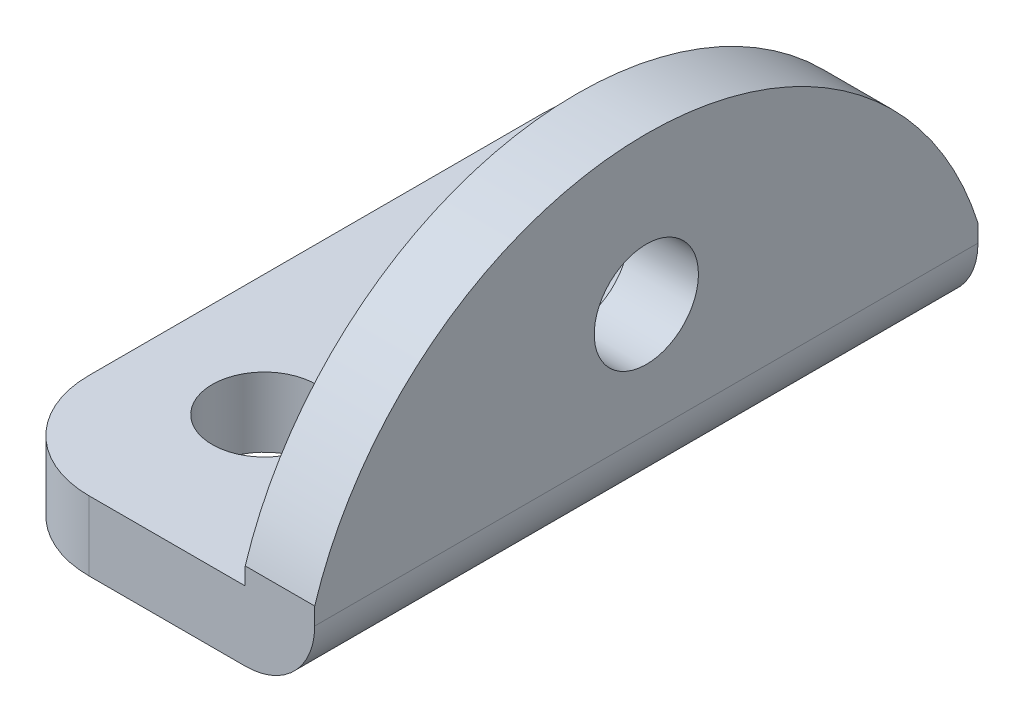
ISO-10303-21;
HEADER;
FILE_DESCRIPTION(('STEP AP214'),'2;1');
FILE_NAME('part.step','',(''),(''),'','','');
FILE_SCHEMA(('AUTOMOTIVE_DESIGN { 1 0 10303 214 1 1 1 1 }'));
ENDSEC;
DATA;
#1=APPLICATION_CONTEXT('core data for automotive mechanical design processes');
#2=APPLICATION_PROTOCOL_DEFINITION('international standard','automotive_design',2000,#1);
#3=PRODUCT_CONTEXT('',#1,'mechanical');
#4=PRODUCT('Part','Part','',(#3));
#5=PRODUCT_RELATED_PRODUCT_CATEGORY('part','',(#4));
#6=PRODUCT_DEFINITION_FORMATION('','',#4);
#7=PRODUCT_DEFINITION_CONTEXT('part definition',#1,'design');
#8=PRODUCT_DEFINITION('design','',#6,#7);
#9=PRODUCT_DEFINITION_SHAPE('','',#8);
#10=(LENGTH_UNIT() NAMED_UNIT(*) SI_UNIT(.MILLI.,.METRE.));
#11=(NAMED_UNIT(*) PLANE_ANGLE_UNIT() SI_UNIT($,.RADIAN.));
#12=(NAMED_UNIT(*) SI_UNIT($,.STERADIAN.) SOLID_ANGLE_UNIT());
#13=UNCERTAINTY_MEASURE_WITH_UNIT(LENGTH_MEASURE(1.E-05),#10,'distance_accuracy_value','');
#14=(GEOMETRIC_REPRESENTATION_CONTEXT(3) GLOBAL_UNCERTAINTY_ASSIGNED_CONTEXT((#13)) GLOBAL_UNIT_ASSIGNED_CONTEXT((#10,
#11,#12)) REPRESENTATION_CONTEXT('',''));
#15=CARTESIAN_POINT('',(0.,0.,0.));
#16=DIRECTION('',(0.,0.,1.));
#17=DIRECTION('',(1.,0.,0.));
#18=AXIS2_PLACEMENT_3D('',#15,#16,#17);
#19=CARTESIAN_POINT('',(0.,5.25,0.));
#20=DIRECTION('',(1.,0.,0.));
#21=DIRECTION('',(0.,0.,-1.));
#22=AXIS2_PLACEMENT_3D('',#19,#20,#21);
#23=CYLINDRICAL_SURFACE('',#22,1.5);
#24=CARTESIAN_POINT('',(0.,5.25,0.));
#25=DIRECTION('',(1.,0.,0.));
#26=DIRECTION('',(0.,0.,-1.));
#27=AXIS2_PLACEMENT_3D('',#24,#25,#26);
#28=CIRCLE('',#27,1.5);
#29=CARTESIAN_POINT('',(0.,5.25,-1.5));
#30=VERTEX_POINT('',#29);
#31=EDGE_CURVE('E110',#30,#30,#28,.F.);
#32=ORIENTED_EDGE('',*,*,#31,.F.);
#33=EDGE_LOOP('',(#32));
#34=FACE_BOUND('',#33,.T.);
#35=CARTESIAN_POINT('',(-2.,5.25,0.));
#36=DIRECTION('',(1.,0.,0.));
#37=DIRECTION('',(0.,0.,-1.));
#38=AXIS2_PLACEMENT_3D('',#35,#36,#37);
#39=CIRCLE('',#38,1.5);
#40=CARTESIAN_POINT('',(-2.,5.25,-1.5));
#41=VERTEX_POINT('',#40);
#42=EDGE_CURVE('E19',#41,#41,#39,.F.);
#43=ORIENTED_EDGE('',*,*,#42,.T.);
#44=EDGE_LOOP('',(#43));
#45=FACE_BOUND('',#44,.T.);
#46=ADVANCED_FACE('F16',(#34,#45),#23,.F.);
#47=CARTESIAN_POINT('',(0.,-0.514464285714287,0.));
#48=DIRECTION('',(1.,0.,0.));
#49=DIRECTION('',(0.,0.,-1.));
#50=AXIS2_PLACEMENT_3D('',#47,#48,#49);
#51=CYLINDRICAL_SURFACE('',#50,10.0144642857143);
#52=CARTESIAN_POINT('',(-2.,-0.514464285714287,0.));
#53=DIRECTION('',(1.,0.,0.));
#54=DIRECTION('',(0.,0.,-1.));
#55=AXIS2_PLACEMENT_3D('',#52,#53,#54);
#56=CIRCLE('',#55,10.0144642857143);
#57=CARTESIAN_POINT('',(-2.,2.5,-9.55));
#58=VERTEX_POINT('',#57);
#59=CARTESIAN_POINT('',(-2.,2.5,9.55));
#60=VERTEX_POINT('',#59);
#61=EDGE_CURVE('E88',#58,#60,#56,.T.);
#62=ORIENTED_EDGE('',*,*,#61,.T.);
#63=DIRECTION('',(1.,0.,0.));
#64=VECTOR('',#63,1.);
#65=CARTESIAN_POINT('',(-2.,2.5,9.55));
#66=LINE('',#65,#64);
#67=CARTESIAN_POINT('',(0.,2.5,9.55));
#68=VERTEX_POINT('',#67);
#69=EDGE_CURVE('E92',#68,#60,#66,.F.);
#70=ORIENTED_EDGE('',*,*,#69,.F.);
#71=CARTESIAN_POINT('',(0.,-0.514464285714287,0.));
#72=DIRECTION('',(1.,0.,0.));
#73=DIRECTION('',(0.,0.,-1.));
#74=AXIS2_PLACEMENT_3D('',#71,#72,#73);
#75=CIRCLE('',#74,10.0144642857143);
#76=CARTESIAN_POINT('',(0.,2.5,-9.55));
#77=VERTEX_POINT('',#76);
#78=EDGE_CURVE('E113',#77,#68,#75,.T.);
#79=ORIENTED_EDGE('',*,*,#78,.F.);
#80=DIRECTION('',(1.,0.,0.));
#81=VECTOR('',#80,1.);
#82=CARTESIAN_POINT('',(0.,2.5,-9.55));
#83=LINE('',#82,#81);
#84=EDGE_CURVE('E94',#77,#58,#83,.F.);
#85=ORIENTED_EDGE('',*,*,#84,.T.);
#86=EDGE_LOOP('',(#62,#70,#79,#85));
#87=FACE_BOUND('',#86,.T.);
#88=ADVANCED_FACE('F90',(#87),#51,.T.);
#89=CARTESIAN_POINT('',(-2.,0.,9.55));
#90=DIRECTION('',(1.,0.,0.));
#91=DIRECTION('',(0.,0.,-1.));
#92=AXIS2_PLACEMENT_3D('',#89,#90,#91);
#93=PLANE('',#92);
#94=ORIENTED_EDGE('',*,*,#61,.F.);
#95=DIRECTION('',(0.,1.,0.));
#96=VECTOR('',#95,1.);
#97=CARTESIAN_POINT('',(-2.,0.,-9.55));
#98=LINE('',#97,#96);
#99=CARTESIAN_POINT('',(-2.,2.,-9.55));
#100=VERTEX_POINT('',#99);
#101=EDGE_CURVE('E83',#100,#58,#98,.T.);
#102=ORIENTED_EDGE('',*,*,#101,.F.);
#103=DIRECTION('',(0.,0.,1.));
#104=VECTOR('',#103,1.);
#105=CARTESIAN_POINT('',(-2.,2.,9.55));
#106=LINE('',#105,#104);
#107=CARTESIAN_POINT('',(-2.,2.,9.55));
#108=VERTEX_POINT('',#107);
#109=EDGE_CURVE('E108',#100,#108,#106,.T.);
#110=ORIENTED_EDGE('',*,*,#109,.T.);
#111=DIRECTION('',(0.,1.,0.));
#112=VECTOR('',#111,1.);
#113=CARTESIAN_POINT('',(-2.,0.,9.55));
#114=LINE('',#113,#112);
#115=EDGE_CURVE('E97',#60,#108,#114,.F.);
#116=ORIENTED_EDGE('',*,*,#115,.F.);
#117=EDGE_LOOP('',(#94,#102,#110,#116));
#118=FACE_BOUND('',#117,.T.);
#119=ORIENTED_EDGE('',*,*,#42,.F.);
#120=EDGE_LOOP('',(#119));
#121=FACE_BOUND('',#120,.T.);
#122=ADVANCED_FACE('F105',(#118,#121),#93,.F.);
#123=CARTESIAN_POINT('',(0.,0.,9.55));
#124=DIRECTION('',(1.,0.,0.));
#125=DIRECTION('',(0.,0.,-1.));
#126=AXIS2_PLACEMENT_3D('',#123,#124,#125);
#127=PLANE('',#126);
#128=DIRECTION('',(0.,0.,-1.));
#129=VECTOR('',#128,1.);
#130=CARTESIAN_POINT('',(0.,2.,9.55));
#131=LINE('',#130,#129);
#132=CARTESIAN_POINT('',(0.,2.,-9.55));
#133=VERTEX_POINT('',#132);
#134=CARTESIAN_POINT('',(0.,2.,9.55));
#135=VERTEX_POINT('',#134);
#136=EDGE_CURVE('E145',#133,#135,#131,.F.);
#137=ORIENTED_EDGE('',*,*,#136,.F.);
#138=DIRECTION('',(0.,1.,0.));
#139=VECTOR('',#138,1.);
#140=CARTESIAN_POINT('',(0.,2.,-9.55));
#141=LINE('',#140,#139);
#142=EDGE_CURVE('E125',#77,#133,#141,.F.);
#143=ORIENTED_EDGE('',*,*,#142,.F.);
#144=ORIENTED_EDGE('',*,*,#78,.T.);
#145=DIRECTION('',(0.,1.,0.));
#146=VECTOR('',#145,1.);
#147=CARTESIAN_POINT('',(0.,0.,9.55));
#148=LINE('',#147,#146);
#149=EDGE_CURVE('E102',#68,#135,#148,.F.);
#150=ORIENTED_EDGE('',*,*,#149,.T.);
#151=EDGE_LOOP('',(#137,#143,#144,#150));
#152=FACE_BOUND('',#151,.T.);
#153=ORIENTED_EDGE('',*,*,#31,.T.);
#154=EDGE_LOOP('',(#153));
#155=FACE_BOUND('',#154,.T.);
#156=ADVANCED_FACE('F203',(#152,#155),#127,.T.);
#157=CARTESIAN_POINT('',(0.,2.,9.55));
#158=DIRECTION('',(0.,-1.,0.));
#159=DIRECTION('',(1.,0.,0.));
#160=AXIS2_PLACEMENT_3D('',#157,#158,#159);
#161=PLANE('',#160);
#162=CARTESIAN_POINT('',(-6.5,2.,-6.55));
#163=DIRECTION('',(0.,-1.,0.));
#164=DIRECTION('',(0.,0.,-1.));
#165=AXIS2_PLACEMENT_3D('',#162,#163,#164);
#166=CIRCLE('',#165,3.);
#167=CARTESIAN_POINT('',(-9.5,2.,-6.55));
#168=VERTEX_POINT('',#167);
#169=CARTESIAN_POINT('',(-6.5,2.,-9.55));
#170=VERTEX_POINT('',#169);
#171=EDGE_CURVE('E150',#168,#170,#166,.T.);
#172=ORIENTED_EDGE('',*,*,#171,.F.);
#173=DIRECTION('',(0.,0.,1.));
#174=VECTOR('',#173,1.);
#175=CARTESIAN_POINT('',(-9.5,2.,9.55));
#176=LINE('',#175,#174);
#177=CARTESIAN_POINT('',(-9.5,2.,6.55));
#178=VERTEX_POINT('',#177);
#179=EDGE_CURVE('E158',#178,#168,#176,.F.);
#180=ORIENTED_EDGE('',*,*,#179,.F.);
#181=CARTESIAN_POINT('',(-6.5,2.,6.55));
#182=DIRECTION('',(0.,1.,0.));
#183=DIRECTION('',(0.,0.,1.));
#184=AXIS2_PLACEMENT_3D('',#181,#182,#183);
#185=CIRCLE('',#184,3.);
#186=CARTESIAN_POINT('',(-6.5,2.,9.55));
#187=VERTEX_POINT('',#186);
#188=EDGE_CURVE('E139',#187,#178,#185,.F.);
#189=ORIENTED_EDGE('',*,*,#188,.F.);
#190=DIRECTION('',(1.,0.,0.));
#191=VECTOR('',#190,1.);
#192=CARTESIAN_POINT('',(-2.,2.,9.55));
#193=LINE('',#192,#191);
#194=EDGE_CURVE('E144',#108,#187,#193,.F.);
#195=ORIENTED_EDGE('',*,*,#194,.F.);
#196=ORIENTED_EDGE('',*,*,#109,.F.);
#197=DIRECTION('',(1.,0.,0.));
#198=VECTOR('',#197,1.);
#199=CARTESIAN_POINT('',(-2.,2.,-9.55));
#200=LINE('',#199,#198);
#201=EDGE_CURVE('E153',#100,#170,#200,.F.);
#202=ORIENTED_EDGE('',*,*,#201,.T.);
#203=EDGE_LOOP('',(#172,#180,#189,#195,#196,#202));
#204=FACE_BOUND('',#203,.T.);
#205=CARTESIAN_POINT('',(-6.,2.,-5.));
#206=DIRECTION('',(0.,1.,0.));
#207=DIRECTION('',(-1.,0.,0.));
#208=AXIS2_PLACEMENT_3D('',#205,#206,#207);
#209=CIRCLE('',#208,1.5);
#210=CARTESIAN_POINT('',(-7.5,2.,-5.));
#211=VERTEX_POINT('',#210);
#212=EDGE_CURVE('E155',#211,#211,#209,.F.);
#213=ORIENTED_EDGE('',*,*,#212,.T.);
#214=EDGE_LOOP('',(#213));
#215=FACE_BOUND('',#214,.T.);
#216=CARTESIAN_POINT('',(-6.,2.,5.));
#217=DIRECTION('',(0.,1.,0.));
#218=DIRECTION('',(-1.,0.,0.));
#219=AXIS2_PLACEMENT_3D('',#216,#217,#218);
#220=CIRCLE('',#219,1.5);
#221=CARTESIAN_POINT('',(-7.5,2.,5.));
#222=VERTEX_POINT('',#221);
#223=EDGE_CURVE('E159',#222,#222,#220,.F.);
#224=ORIENTED_EDGE('',*,*,#223,.T.);
#225=EDGE_LOOP('',(#224));
#226=FACE_BOUND('',#225,.T.);
#227=ADVANCED_FACE('F288',(#204,#215,#226),#161,.F.);
#228=CARTESIAN_POINT('',(-6.,-1.,5.));
#229=DIRECTION('',(0.,1.,0.));
#230=DIRECTION('',(-1.,0.,0.));
#231=AXIS2_PLACEMENT_3D('',#228,#229,#230);
#232=CYLINDRICAL_SURFACE('',#231,1.5);
#233=CARTESIAN_POINT('',(-6.,0.,5.));
#234=DIRECTION('',(0.,1.,0.));
#235=DIRECTION('',(-1.,0.,0.));
#236=AXIS2_PLACEMENT_3D('',#233,#234,#235);
#237=CIRCLE('',#236,1.5);
#238=CARTESIAN_POINT('',(-7.5,0.,5.));
#239=VERTEX_POINT('',#238);
#240=EDGE_CURVE('E135',#239,#239,#237,.T.);
#241=ORIENTED_EDGE('',*,*,#240,.F.);
#242=EDGE_LOOP('',(#241));
#243=FACE_BOUND('',#242,.T.);
#244=ORIENTED_EDGE('',*,*,#223,.F.);
#245=EDGE_LOOP('',(#244));
#246=FACE_BOUND('',#245,.T.);
#247=ADVANCED_FACE('F279',(#243,#246),#232,.F.);
#248=CARTESIAN_POINT('',(-6.,-1.,-5.));
#249=DIRECTION('',(0.,1.,0.));
#250=DIRECTION('',(-1.,0.,0.));
#251=AXIS2_PLACEMENT_3D('',#248,#249,#250);
#252=CYLINDRICAL_SURFACE('',#251,1.5);
#253=CARTESIAN_POINT('',(-6.,0.,-5.));
#254=DIRECTION('',(0.,1.,0.));
#255=DIRECTION('',(-1.,0.,0.));
#256=AXIS2_PLACEMENT_3D('',#253,#254,#255);
#257=CIRCLE('',#256,1.5);
#258=CARTESIAN_POINT('',(-7.5,0.,-5.));
#259=VERTEX_POINT('',#258);
#260=EDGE_CURVE('E132',#259,#259,#257,.T.);
#261=ORIENTED_EDGE('',*,*,#260,.F.);
#262=EDGE_LOOP('',(#261));
#263=FACE_BOUND('',#262,.T.);
#264=ORIENTED_EDGE('',*,*,#212,.F.);
#265=EDGE_LOOP('',(#264));
#266=FACE_BOUND('',#265,.T.);
#267=ADVANCED_FACE('F270',(#263,#266),#252,.F.);
#268=CARTESIAN_POINT('',(-9.5,0.,9.55));
#269=DIRECTION('',(-1.,0.,0.));
#270=DIRECTION('',(0.,0.,1.));
#271=AXIS2_PLACEMENT_3D('',#268,#269,#270);
#272=PLANE('',#271);
#273=DIRECTION('',(0.,0.,1.));
#274=VECTOR('',#273,1.);
#275=CARTESIAN_POINT('',(-9.5,0.,9.55));
#276=LINE('',#275,#274);
#277=CARTESIAN_POINT('',(-9.5,0.,6.55));
#278=VERTEX_POINT('',#277);
#279=CARTESIAN_POINT('',(-9.5,0.,-6.55));
#280=VERTEX_POINT('',#279);
#281=EDGE_CURVE('E131',#278,#280,#276,.F.);
#282=ORIENTED_EDGE('',*,*,#281,.F.);
#283=DIRECTION('',(0.,1.,0.));
#284=VECTOR('',#283,1.);
#285=CARTESIAN_POINT('',(-9.5,0.,6.55));
#286=LINE('',#285,#284);
#287=EDGE_CURVE('E138',#178,#278,#286,.F.);
#288=ORIENTED_EDGE('',*,*,#287,.F.);
#289=ORIENTED_EDGE('',*,*,#179,.T.);
#290=DIRECTION('',(0.,-1.,0.));
#291=VECTOR('',#290,1.);
#292=CARTESIAN_POINT('',(-9.5,2.,-6.55));
#293=LINE('',#292,#291);
#294=EDGE_CURVE('E154',#280,#168,#293,.F.);
#295=ORIENTED_EDGE('',*,*,#294,.F.);
#296=EDGE_LOOP('',(#282,#288,#289,#295));
#297=FACE_BOUND('',#296,.T.);
#298=ADVANCED_FACE('F215',(#297),#272,.T.);
#299=CARTESIAN_POINT('',(-6.5,2.,-6.55));
#300=DIRECTION('',(0.,-1.,0.));
#301=DIRECTION('',(0.,0.,-1.));
#302=AXIS2_PLACEMENT_3D('',#299,#300,#301);
#303=CYLINDRICAL_SURFACE('',#302,3.);
#304=ORIENTED_EDGE('',*,*,#171,.T.);
#305=DIRECTION('',(0.,1.,0.));
#306=VECTOR('',#305,1.);
#307=CARTESIAN_POINT('',(-6.5,2.,-9.55));
#308=LINE('',#307,#306);
#309=CARTESIAN_POINT('',(-6.5,0.,-9.55));
#310=VERTEX_POINT('',#309);
#311=EDGE_CURVE('E149',#170,#310,#308,.F.);
#312=ORIENTED_EDGE('',*,*,#311,.T.);
#313=CARTESIAN_POINT('',(-6.5,0.,-6.55));
#314=DIRECTION('',(0.,-1.,0.));
#315=DIRECTION('',(0.,0.,-1.));
#316=AXIS2_PLACEMENT_3D('',#313,#314,#315);
#317=CIRCLE('',#316,3.);
#318=EDGE_CURVE('E127',#280,#310,#317,.T.);
#319=ORIENTED_EDGE('',*,*,#318,.F.);
#320=ORIENTED_EDGE('',*,*,#294,.T.);
#321=EDGE_LOOP('',(#304,#312,#319,#320));
#322=FACE_BOUND('',#321,.T.);
#323=ADVANCED_FACE('F207',(#322),#303,.T.);
#324=CARTESIAN_POINT('',(-2.,2.,-9.55));
#325=DIRECTION('',(0.,0.,1.));
#326=DIRECTION('',(1.,0.,0.));
#327=AXIS2_PLACEMENT_3D('',#324,#325,#326);
#328=PLANE('',#327);
#329=ORIENTED_EDGE('',*,*,#311,.F.);
#330=ORIENTED_EDGE('',*,*,#201,.F.);
#331=ORIENTED_EDGE('',*,*,#101,.T.);
#332=ORIENTED_EDGE('',*,*,#84,.F.);
#333=ORIENTED_EDGE('',*,*,#142,.T.);
#334=CARTESIAN_POINT('',(-2.,2.,-9.55));
#335=DIRECTION('',(0.,0.,-1.));
#336=DIRECTION('',(-1.,0.,0.));
#337=AXIS2_PLACEMENT_3D('',#334,#335,#336);
#338=CIRCLE('',#337,2.);
#339=CARTESIAN_POINT('',(-2.,0.,-9.55));
#340=VERTEX_POINT('',#339);
#341=EDGE_CURVE('E146',#340,#133,#338,.F.);
#342=ORIENTED_EDGE('',*,*,#341,.F.);
#343=DIRECTION('',(1.,0.,0.));
#344=VECTOR('',#343,1.);
#345=CARTESIAN_POINT('',(0.,0.,-9.55));
#346=LINE('',#345,#344);
#347=EDGE_CURVE('E130',#310,#340,#346,.T.);
#348=ORIENTED_EDGE('',*,*,#347,.F.);
#349=EDGE_LOOP('',(#329,#330,#331,#332,#333,#342,#348));
#350=FACE_BOUND('',#349,.T.);
#351=ADVANCED_FACE('F205',(#350),#328,.F.);
#352=CARTESIAN_POINT('',(-2.,2.,9.55));
#353=DIRECTION('',(0.,0.,-1.));
#354=DIRECTION('',(-1.,0.,0.));
#355=AXIS2_PLACEMENT_3D('',#352,#353,#354);
#356=CYLINDRICAL_SURFACE('',#355,2.);
#357=CARTESIAN_POINT('',(-2.,2.,9.55));
#358=DIRECTION('',(0.,0.,-1.));
#359=DIRECTION('',(-1.,0.,0.));
#360=AXIS2_PLACEMENT_3D('',#357,#358,#359);
#361=CIRCLE('',#360,2.);
#362=CARTESIAN_POINT('',(-2.,0.,9.55));
#363=VERTEX_POINT('',#362);
#364=EDGE_CURVE('E142',#135,#363,#361,.T.);
#365=ORIENTED_EDGE('',*,*,#364,.T.);
#366=DIRECTION('',(0.,0.,1.));
#367=VECTOR('',#366,1.);
#368=CARTESIAN_POINT('',(-2.,0.,9.55));
#369=LINE('',#368,#367);
#370=EDGE_CURVE('E177',#340,#363,#369,.T.);
#371=ORIENTED_EDGE('',*,*,#370,.F.);
#372=ORIENTED_EDGE('',*,*,#341,.T.);
#373=ORIENTED_EDGE('',*,*,#136,.T.);
#374=EDGE_LOOP('',(#365,#371,#372,#373));
#375=FACE_BOUND('',#374,.T.);
#376=ADVANCED_FACE('F201',(#375),#356,.T.);
#377=CARTESIAN_POINT('',(-2.,2.,9.55));
#378=DIRECTION('',(0.,0.,1.));
#379=DIRECTION('',(1.,0.,0.));
#380=AXIS2_PLACEMENT_3D('',#377,#378,#379);
#381=PLANE('',#380);
#382=DIRECTION('',(1.,0.,0.));
#383=VECTOR('',#382,1.);
#384=CARTESIAN_POINT('',(0.,0.,9.55));
#385=LINE('',#384,#383);
#386=CARTESIAN_POINT('',(-6.5,0.,9.55));
#387=VERTEX_POINT('',#386);
#388=EDGE_CURVE('E25',#363,#387,#385,.F.);
#389=ORIENTED_EDGE('',*,*,#388,.F.);
#390=ORIENTED_EDGE('',*,*,#364,.F.);
#391=ORIENTED_EDGE('',*,*,#149,.F.);
#392=ORIENTED_EDGE('',*,*,#69,.T.);
#393=ORIENTED_EDGE('',*,*,#115,.T.);
#394=ORIENTED_EDGE('',*,*,#194,.T.);
#395=DIRECTION('',(0.,1.,0.));
#396=VECTOR('',#395,1.);
#397=CARTESIAN_POINT('',(-6.5,0.,9.55));
#398=LINE('',#397,#396);
#399=EDGE_CURVE('E34',#387,#187,#398,.T.);
#400=ORIENTED_EDGE('',*,*,#399,.F.);
#401=EDGE_LOOP('',(#389,#390,#391,#392,#393,#394,#400));
#402=FACE_BOUND('',#401,.T.);
#403=ADVANCED_FACE('F99',(#402),#381,.T.);
#404=CARTESIAN_POINT('',(-6.5,0.,6.55));
#405=DIRECTION('',(0.,1.,0.));
#406=DIRECTION('',(0.,0.,1.));
#407=AXIS2_PLACEMENT_3D('',#404,#405,#406);
#408=CYLINDRICAL_SURFACE('',#407,3.);
#409=ORIENTED_EDGE('',*,*,#188,.T.);
#410=ORIENTED_EDGE('',*,*,#287,.T.);
#411=CARTESIAN_POINT('',(-6.5,0.,6.55));
#412=DIRECTION('',(0.,1.,0.));
#413=DIRECTION('',(0.,0.,1.));
#414=AXIS2_PLACEMENT_3D('',#411,#412,#413);
#415=CIRCLE('',#414,3.);
#416=EDGE_CURVE('E11',#387,#278,#415,.F.);
#417=ORIENTED_EDGE('',*,*,#416,.F.);
#418=ORIENTED_EDGE('',*,*,#399,.T.);
#419=EDGE_LOOP('',(#409,#410,#417,#418));
#420=FACE_BOUND('',#419,.T.);
#421=ADVANCED_FACE('F218',(#420),#408,.T.);
#422=CARTESIAN_POINT('',(0.,0.,9.55));
#423=DIRECTION('',(0.,-1.,0.));
#424=DIRECTION('',(1.,0.,0.));
#425=AXIS2_PLACEMENT_3D('',#422,#423,#424);
#426=PLANE('',#425);
#427=ORIENTED_EDGE('',*,*,#388,.T.);
#428=ORIENTED_EDGE('',*,*,#416,.T.);
#429=ORIENTED_EDGE('',*,*,#281,.T.);
#430=ORIENTED_EDGE('',*,*,#318,.T.);
#431=ORIENTED_EDGE('',*,*,#347,.T.);
#432=ORIENTED_EDGE('',*,*,#370,.T.);
#433=EDGE_LOOP('',(#427,#428,#429,#430,#431,#432));
#434=FACE_BOUND('',#433,.T.);
#435=ORIENTED_EDGE('',*,*,#260,.T.);
#436=EDGE_LOOP('',(#435));
#437=FACE_BOUND('',#436,.T.);
#438=ORIENTED_EDGE('',*,*,#240,.T.);
#439=EDGE_LOOP('',(#438));
#440=FACE_BOUND('',#439,.T.);
#441=ADVANCED_FACE('F198',(#434,#437,#440),#426,.T.);
#442=CLOSED_SHELL('',(#46,#88,#122,#156,#227,#247,#267,#298,#323,#351,#376,#403,#421,#441));
#443=MANIFOLD_SOLID_BREP('B1',#442);
#444=ADVANCED_BREP_SHAPE_REPRESENTATION('',(#18,#443),#14);
#445=SHAPE_DEFINITION_REPRESENTATION(#9,#444);
ENDSEC;
END-ISO-10303-21;
